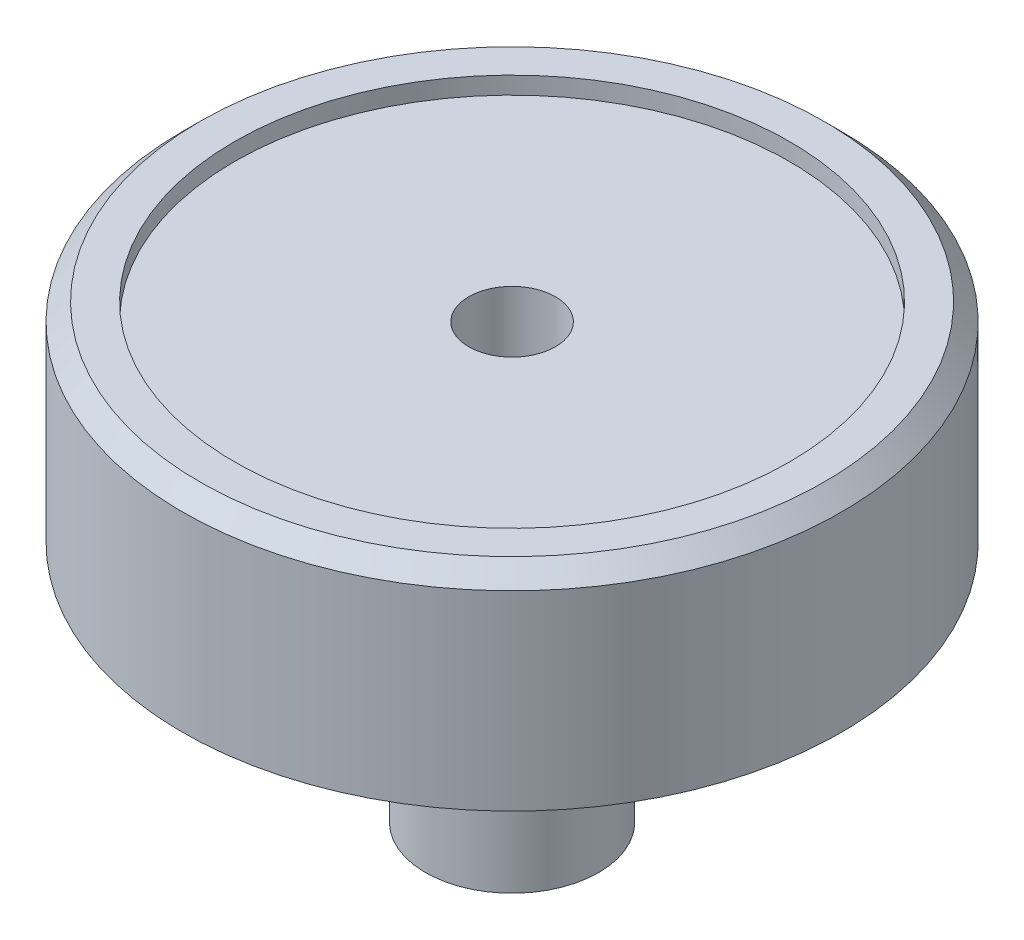
ISO-10303-21;
HEADER;
FILE_DESCRIPTION(('STEP AP214'),'2;1');
FILE_NAME('part.step','',(''),(''),'','','');
FILE_SCHEMA(('AUTOMOTIVE_DESIGN { 1 0 10303 214 1 1 1 1 }'));
ENDSEC;
DATA;
#1=APPLICATION_CONTEXT('core data for automotive mechanical design processes');
#2=APPLICATION_PROTOCOL_DEFINITION('international standard','automotive_design',2000,#1);
#3=PRODUCT_CONTEXT('',#1,'mechanical');
#4=PRODUCT('Part','Part','',(#3));
#5=PRODUCT_RELATED_PRODUCT_CATEGORY('part','',(#4));
#6=PRODUCT_DEFINITION_FORMATION('','',#4);
#7=PRODUCT_DEFINITION_CONTEXT('part definition',#1,'design');
#8=PRODUCT_DEFINITION('design','',#6,#7);
#9=PRODUCT_DEFINITION_SHAPE('','',#8);
#10=(LENGTH_UNIT() NAMED_UNIT(*) SI_UNIT(.MILLI.,.METRE.));
#11=(NAMED_UNIT(*) PLANE_ANGLE_UNIT() SI_UNIT($,.RADIAN.));
#12=(NAMED_UNIT(*) SI_UNIT($,.STERADIAN.) SOLID_ANGLE_UNIT());
#13=UNCERTAINTY_MEASURE_WITH_UNIT(LENGTH_MEASURE(1.E-05),#10,'distance_accuracy_value','');
#14=(GEOMETRIC_REPRESENTATION_CONTEXT(3) GLOBAL_UNCERTAINTY_ASSIGNED_CONTEXT((#13)) GLOBAL_UNIT_ASSIGNED_CONTEXT((#10,
#11,#12)) REPRESENTATION_CONTEXT('',''));
#15=CARTESIAN_POINT('',(0.,0.,0.));
#16=DIRECTION('',(0.,0.,1.));
#17=DIRECTION('',(1.,0.,0.));
#18=AXIS2_PLACEMENT_3D('',#15,#16,#17);
#19=CARTESIAN_POINT('',(-6.,0.,0.));
#20=DIRECTION('',(0.,-1.,0.));
#21=DIRECTION('',(1.,0.,0.));
#22=AXIS2_PLACEMENT_3D('',#19,#20,#21);
#23=PLANE('',#22);
#24=CARTESIAN_POINT('',(0.,0.,0.));
#25=DIRECTION('',(0.,1.,0.));
#26=DIRECTION('',(-1.,0.,0.));
#27=AXIS2_PLACEMENT_3D('',#24,#25,#26);
#28=CIRCLE('',#27,6.00000000000001);
#29=CARTESIAN_POINT('',(-6.,0.,0.));
#30=VERTEX_POINT('',#29);
#31=EDGE_CURVE('E163',#30,#30,#28,.T.);
#32=ORIENTED_EDGE('',*,*,#31,.F.);
#33=EDGE_LOOP('',(#32));
#34=FACE_BOUND('',#33,.T.);
#35=DIRECTION('',(1.,0.,0.));
#36=VECTOR('',#35,1.);
#37=CARTESIAN_POINT('',(-1.175,0.,-3.175));
#38=LINE('',#37,#36);
#39=CARTESIAN_POINT('',(-1.175,0.,-3.175));
#40=VERTEX_POINT('',#39);
#41=CARTESIAN_POINT('',(1.175,0.,-3.175));
#42=VERTEX_POINT('',#41);
#43=EDGE_CURVE('E135',#40,#42,#38,.T.);
#44=ORIENTED_EDGE('',*,*,#43,.F.);
#45=CARTESIAN_POINT('',(-1.175,0.,-1.175));
#46=DIRECTION('',(0.,-1.,0.));
#47=DIRECTION('',(1.,0.,0.));
#48=AXIS2_PLACEMENT_3D('',#45,#46,#47);
#49=CIRCLE('',#48,2.);
#50=CARTESIAN_POINT('',(-3.175,0.,-1.175));
#51=VERTEX_POINT('',#50);
#52=EDGE_CURVE('E132',#51,#40,#49,.T.);
#53=ORIENTED_EDGE('',*,*,#52,.F.);
#54=DIRECTION('',(0.,0.,-1.));
#55=VECTOR('',#54,1.);
#56=CARTESIAN_POINT('',(-3.175,0.,1.175));
#57=LINE('',#56,#55);
#58=CARTESIAN_POINT('',(-3.175,0.,1.175));
#59=VERTEX_POINT('',#58);
#60=EDGE_CURVE('E85',#59,#51,#57,.T.);
#61=ORIENTED_EDGE('',*,*,#60,.F.);
#62=CARTESIAN_POINT('',(-1.175,0.,1.175));
#63=DIRECTION('',(0.,-1.,0.));
#64=DIRECTION('',(1.,0.,0.));
#65=AXIS2_PLACEMENT_3D('',#62,#63,#64);
#66=CIRCLE('',#65,2.);
#67=CARTESIAN_POINT('',(-1.175,0.,3.175));
#68=VERTEX_POINT('',#67);
#69=EDGE_CURVE('E145',#68,#59,#66,.T.);
#70=ORIENTED_EDGE('',*,*,#69,.F.);
#71=DIRECTION('',(-1.,0.,0.));
#72=VECTOR('',#71,1.);
#73=CARTESIAN_POINT('',(-1.175,0.,3.175));
#74=LINE('',#73,#72);
#75=CARTESIAN_POINT('',(1.175,0.,3.175));
#76=VERTEX_POINT('',#75);
#77=EDGE_CURVE('E121',#76,#68,#74,.T.);
#78=ORIENTED_EDGE('',*,*,#77,.F.);
#79=CARTESIAN_POINT('',(1.175,0.,1.175));
#80=DIRECTION('',(0.,-1.,0.));
#81=DIRECTION('',(-1.,0.,0.));
#82=AXIS2_PLACEMENT_3D('',#79,#80,#81);
#83=CIRCLE('',#82,2.);
#84=CARTESIAN_POINT('',(3.175,0.,1.175));
#85=VERTEX_POINT('',#84);
#86=EDGE_CURVE('E142',#85,#76,#83,.T.);
#87=ORIENTED_EDGE('',*,*,#86,.F.);
#88=DIRECTION('',(0.,0.,1.));
#89=VECTOR('',#88,1.);
#90=CARTESIAN_POINT('',(3.175,0.,1.175));
#91=LINE('',#90,#89);
#92=CARTESIAN_POINT('',(3.175,0.,-1.175));
#93=VERTEX_POINT('',#92);
#94=EDGE_CURVE('E140',#93,#85,#91,.T.);
#95=ORIENTED_EDGE('',*,*,#94,.F.);
#96=CARTESIAN_POINT('',(1.175,0.,-1.175));
#97=DIRECTION('',(0.,-1.,0.));
#98=DIRECTION('',(1.,0.,0.));
#99=AXIS2_PLACEMENT_3D('',#96,#97,#98);
#100=CIRCLE('',#99,2.);
#101=EDGE_CURVE('E138',#42,#93,#100,.T.);
#102=ORIENTED_EDGE('',*,*,#101,.F.);
#103=EDGE_LOOP('',(#44,#53,#61,#70,#78,#87,#95,#102));
#104=FACE_BOUND('',#103,.T.);
#105=ADVANCED_FACE('F35',(#34,#104),#23,.T.);
#106=CARTESIAN_POINT('',(0.,4.50000000000001,0.));
#107=DIRECTION('',(0.,1.,0.));
#108=DIRECTION('',(-1.,0.,0.));
#109=AXIS2_PLACEMENT_3D('',#106,#107,#108);
#110=PLANE('',#109);
#111=CARTESIAN_POINT('',(0.,4.50000000000001,0.));
#112=DIRECTION('',(0.,1.,0.));
#113=DIRECTION('',(-1.,0.,0.));
#114=AXIS2_PLACEMENT_3D('',#111,#112,#113);
#115=CIRCLE('',#114,8.);
#116=CARTESIAN_POINT('',(-8.,4.50000000000001,0.));
#117=VERTEX_POINT('',#116);
#118=EDGE_CURVE('E378',#117,#117,#115,.T.);
#119=ORIENTED_EDGE('',*,*,#118,.F.);
#120=EDGE_LOOP('',(#119));
#121=FACE_BOUND('',#120,.T.);
#122=CARTESIAN_POINT('',(0.,4.50000000000001,0.));
#123=DIRECTION('',(0.,1.,0.));
#124=DIRECTION('',(-1.,0.,0.));
#125=AXIS2_PLACEMENT_3D('',#122,#123,#124);
#126=CIRCLE('',#125,9.);
#127=CARTESIAN_POINT('',(-9.,4.5,0.));
#128=VERTEX_POINT('',#127);
#129=EDGE_CURVE('E171',#128,#128,#126,.T.);
#130=ORIENTED_EDGE('',*,*,#129,.T.);
#131=EDGE_LOOP('',(#130));
#132=FACE_BOUND('',#131,.T.);
#133=ADVANCED_FACE('F196',(#121,#132),#110,.T.);
#134=CARTESIAN_POINT('',(0.,4.5,0.));
#135=DIRECTION('',(0.,1.,0.));
#136=DIRECTION('',(-1.,0.,0.));
#137=AXIS2_PLACEMENT_3D('',#134,#135,#136);
#138=CYLINDRICAL_SURFACE('',#137,9.50000000000001);
#139=CARTESIAN_POINT('',(0.,4.,0.));
#140=DIRECTION('',(0.,1.,0.));
#141=DIRECTION('',(-1.,0.,0.));
#142=AXIS2_PLACEMENT_3D('',#139,#140,#141);
#143=CIRCLE('',#142,9.50000000000001);
#144=CARTESIAN_POINT('',(-9.5,3.99999999999999,0.));
#145=VERTEX_POINT('',#144);
#146=EDGE_CURVE('E39',#145,#145,#143,.F.);
#147=ORIENTED_EDGE('',*,*,#146,.T.);
#148=EDGE_LOOP('',(#147));
#149=FACE_BOUND('',#148,.T.);
#150=CARTESIAN_POINT('',(0.,-1.49999999999999,0.));
#151=DIRECTION('',(0.,1.,0.));
#152=DIRECTION('',(-1.,0.,0.));
#153=AXIS2_PLACEMENT_3D('',#150,#151,#152);
#154=CIRCLE('',#153,9.50000000000001);
#155=CARTESIAN_POINT('',(-9.5,-1.5,0.));
#156=VERTEX_POINT('',#155);
#157=EDGE_CURVE('E169',#156,#156,#154,.T.);
#158=ORIENTED_EDGE('',*,*,#157,.T.);
#159=EDGE_LOOP('',(#158));
#160=FACE_BOUND('',#159,.T.);
#161=ADVANCED_FACE('F178',(#149,#160),#138,.T.);
#162=CARTESIAN_POINT('',(-9.5,-1.5,0.));
#163=DIRECTION('',(0.,-1.,0.));
#164=DIRECTION('',(1.,0.,0.));
#165=AXIS2_PLACEMENT_3D('',#162,#163,#164);
#166=PLANE('',#165);
#167=CARTESIAN_POINT('',(0.,-1.49999999999999,0.));
#168=DIRECTION('',(0.,1.,0.));
#169=DIRECTION('',(-1.,0.,0.));
#170=AXIS2_PLACEMENT_3D('',#167,#168,#169);
#171=CIRCLE('',#170,6.00000000000001);
#172=CARTESIAN_POINT('',(-6.,-1.5,0.));
#173=VERTEX_POINT('',#172);
#174=EDGE_CURVE('E166',#173,#173,#171,.T.);
#175=ORIENTED_EDGE('',*,*,#174,.T.);
#176=EDGE_LOOP('',(#175));
#177=FACE_BOUND('',#176,.T.);
#178=ORIENTED_EDGE('',*,*,#157,.F.);
#179=EDGE_LOOP('',(#178));
#180=FACE_BOUND('',#179,.T.);
#181=ADVANCED_FACE('F192',(#177,#180),#166,.T.);
#182=CARTESIAN_POINT('',(0.,4.5,0.));
#183=DIRECTION('',(0.,1.,0.));
#184=DIRECTION('',(-1.,0.,0.));
#185=AXIS2_PLACEMENT_3D('',#182,#183,#184);
#186=CYLINDRICAL_SURFACE('',#185,6.00000000000001);
#187=ORIENTED_EDGE('',*,*,#31,.T.);
#188=EDGE_LOOP('',(#187));
#189=FACE_BOUND('',#188,.T.);
#190=ORIENTED_EDGE('',*,*,#174,.F.);
#191=EDGE_LOOP('',(#190));
#192=FACE_BOUND('',#191,.T.);
#193=ADVANCED_FACE('F184',(#189,#192),#186,.F.);
#194=CARTESIAN_POINT('',(0.,4.50000000000001,0.));
#195=DIRECTION('',(0.,-1.,0.));
#196=DIRECTION('',(1.,0.,0.));
#197=AXIS2_PLACEMENT_3D('',#194,#195,#196);
#198=CONICAL_SURFACE('',#197,9.,0.785398163397447);
#199=ORIENTED_EDGE('',*,*,#146,.F.);
#200=EDGE_LOOP('',(#199));
#201=FACE_BOUND('',#200,.T.);
#202=ORIENTED_EDGE('',*,*,#129,.F.);
#203=EDGE_LOOP('',(#202));
#204=FACE_BOUND('',#203,.T.);
#205=ADVANCED_FACE('F37',(#201,#204),#198,.T.);
#206=CARTESIAN_POINT('',(-1.17499999999999,-5.5,-1.175));
#207=DIRECTION('',(0.,1.,0.));
#208=DIRECTION('',(-1.,0.,0.));
#209=AXIS2_PLACEMENT_3D('',#206,#207,#208);
#210=CYLINDRICAL_SURFACE('',#209,2.);
#211=ORIENTED_EDGE('',*,*,#52,.T.);
#212=DIRECTION('',(0.,1.,0.));
#213=VECTOR('',#212,1.);
#214=CARTESIAN_POINT('',(-1.17499999999999,-5.5,-3.175));
#215=LINE('',#214,#213);
#216=CARTESIAN_POINT('',(-1.17499999999999,-5.5,-3.175));
#217=VERTEX_POINT('',#216);
#218=EDGE_CURVE('E161',#217,#40,#215,.T.);
#219=ORIENTED_EDGE('',*,*,#218,.F.);
#220=CARTESIAN_POINT('',(-1.17499999999999,-5.5,-1.175));
#221=DIRECTION('',(0.,-1.,0.));
#222=DIRECTION('',(1.,0.,0.));
#223=AXIS2_PLACEMENT_3D('',#220,#221,#222);
#224=CIRCLE('',#223,2.);
#225=CARTESIAN_POINT('',(-3.17499999999999,-5.5,-1.175));
#226=VERTEX_POINT('',#225);
#227=EDGE_CURVE('E148',#226,#217,#224,.T.);
#228=ORIENTED_EDGE('',*,*,#227,.F.);
#229=DIRECTION('',(0.,1.,0.));
#230=VECTOR('',#229,1.);
#231=CARTESIAN_POINT('',(-3.17499999999999,-5.5,-1.175));
#232=LINE('',#231,#230);
#233=EDGE_CURVE('E128',#226,#51,#232,.T.);
#234=ORIENTED_EDGE('',*,*,#233,.T.);
#235=EDGE_LOOP('',(#211,#219,#228,#234));
#236=FACE_BOUND('',#235,.T.);
#237=ADVANCED_FACE('F183',(#236),#210,.T.);
#238=CARTESIAN_POINT('',(-1.17499999999999,-5.5,-3.175));
#239=DIRECTION('',(0.,0.,1.));
#240=DIRECTION('',(1.,0.,0.));
#241=AXIS2_PLACEMENT_3D('',#238,#239,#240);
#242=PLANE('',#241);
#243=ORIENTED_EDGE('',*,*,#43,.T.);
#244=DIRECTION('',(0.,1.,0.));
#245=VECTOR('',#244,1.);
#246=CARTESIAN_POINT('',(1.17500000000001,-5.5,-3.175));
#247=LINE('',#246,#245);
#248=CARTESIAN_POINT('',(1.17500000000001,-5.5,-3.175));
#249=VERTEX_POINT('',#248);
#250=EDGE_CURVE('E158',#249,#42,#247,.T.);
#251=ORIENTED_EDGE('',*,*,#250,.F.);
#252=DIRECTION('',(1.,0.,0.));
#253=VECTOR('',#252,1.);
#254=CARTESIAN_POINT('',(-1.17499999999999,-5.5,-3.175));
#255=LINE('',#254,#253);
#256=EDGE_CURVE('E93',#217,#249,#255,.T.);
#257=ORIENTED_EDGE('',*,*,#256,.F.);
#258=ORIENTED_EDGE('',*,*,#218,.T.);
#259=EDGE_LOOP('',(#243,#251,#257,#258));
#260=FACE_BOUND('',#259,.T.);
#261=ADVANCED_FACE('F189',(#260),#242,.F.);
#262=CARTESIAN_POINT('',(1.17500000000001,-5.5,-1.175));
#263=DIRECTION('',(0.,1.,0.));
#264=DIRECTION('',(-1.,0.,0.));
#265=AXIS2_PLACEMENT_3D('',#262,#263,#264);
#266=CYLINDRICAL_SURFACE('',#265,2.);
#267=ORIENTED_EDGE('',*,*,#101,.T.);
#268=DIRECTION('',(0.,1.,0.));
#269=VECTOR('',#268,1.);
#270=CARTESIAN_POINT('',(3.17500000000001,-5.5,-1.175));
#271=LINE('',#270,#269);
#272=CARTESIAN_POINT('',(3.17500000000001,-5.5,-1.175));
#273=VERTEX_POINT('',#272);
#274=EDGE_CURVE('E155',#273,#93,#271,.T.);
#275=ORIENTED_EDGE('',*,*,#274,.F.);
#276=CARTESIAN_POINT('',(1.17500000000001,-5.5,-1.175));
#277=DIRECTION('',(0.,-1.,0.));
#278=DIRECTION('',(1.,0.,0.));
#279=AXIS2_PLACEMENT_3D('',#276,#277,#278);
#280=CIRCLE('',#279,2.);
#281=EDGE_CURVE('E386',#249,#273,#280,.T.);
#282=ORIENTED_EDGE('',*,*,#281,.F.);
#283=ORIENTED_EDGE('',*,*,#250,.T.);
#284=EDGE_LOOP('',(#267,#275,#282,#283));
#285=FACE_BOUND('',#284,.T.);
#286=ADVANCED_FACE('F248',(#285),#266,.T.);
#287=CARTESIAN_POINT('',(3.17500000000001,-5.5,1.175));
#288=DIRECTION('',(-1.,0.,0.));
#289=DIRECTION('',(0.,-1.,0.));
#290=AXIS2_PLACEMENT_3D('',#287,#288,#289);
#291=PLANE('',#290);
#292=ORIENTED_EDGE('',*,*,#94,.T.);
#293=DIRECTION('',(0.,1.,0.));
#294=VECTOR('',#293,1.);
#295=CARTESIAN_POINT('',(3.17500000000001,-5.5,1.175));
#296=LINE('',#295,#294);
#297=CARTESIAN_POINT('',(3.17500000000001,-5.5,1.175));
#298=VERTEX_POINT('',#297);
#299=EDGE_CURVE('E152',#298,#85,#296,.T.);
#300=ORIENTED_EDGE('',*,*,#299,.F.);
#301=DIRECTION('',(0.,0.,1.));
#302=VECTOR('',#301,1.);
#303=CARTESIAN_POINT('',(3.17500000000001,-5.5,1.175));
#304=LINE('',#303,#302);
#305=EDGE_CURVE('E388',#273,#298,#304,.T.);
#306=ORIENTED_EDGE('',*,*,#305,.F.);
#307=ORIENTED_EDGE('',*,*,#274,.T.);
#308=EDGE_LOOP('',(#292,#300,#306,#307));
#309=FACE_BOUND('',#308,.T.);
#310=ADVANCED_FACE('F255',(#309),#291,.F.);
#311=CARTESIAN_POINT('',(1.17500000000001,-5.5,1.175));
#312=DIRECTION('',(0.,1.,0.));
#313=DIRECTION('',(-1.,0.,0.));
#314=AXIS2_PLACEMENT_3D('',#311,#312,#313);
#315=CYLINDRICAL_SURFACE('',#314,2.);
#316=ORIENTED_EDGE('',*,*,#86,.T.);
#317=DIRECTION('',(0.,1.,0.));
#318=VECTOR('',#317,1.);
#319=CARTESIAN_POINT('',(1.17500000000001,-5.5,3.175));
#320=LINE('',#319,#318);
#321=CARTESIAN_POINT('',(1.17500000000001,-5.5,3.175));
#322=VERTEX_POINT('',#321);
#323=EDGE_CURVE('E124',#322,#76,#320,.T.);
#324=ORIENTED_EDGE('',*,*,#323,.F.);
#325=CARTESIAN_POINT('',(1.17500000000001,-5.5,1.175));
#326=DIRECTION('',(0.,-1.,0.));
#327=DIRECTION('',(-1.,0.,0.));
#328=AXIS2_PLACEMENT_3D('',#325,#326,#327);
#329=CIRCLE('',#328,2.);
#330=EDGE_CURVE('E112',#298,#322,#329,.T.);
#331=ORIENTED_EDGE('',*,*,#330,.F.);
#332=ORIENTED_EDGE('',*,*,#299,.T.);
#333=EDGE_LOOP('',(#316,#324,#331,#332));
#334=FACE_BOUND('',#333,.T.);
#335=ADVANCED_FACE('F264',(#334),#315,.T.);
#336=CARTESIAN_POINT('',(-1.17499999999999,-5.5,3.175));
#337=DIRECTION('',(0.,0.,-1.));
#338=DIRECTION('',(-1.,0.,0.));
#339=AXIS2_PLACEMENT_3D('',#336,#337,#338);
#340=PLANE('',#339);
#341=ORIENTED_EDGE('',*,*,#77,.T.);
#342=DIRECTION('',(0.,1.,0.));
#343=VECTOR('',#342,1.);
#344=CARTESIAN_POINT('',(-1.17499999999999,-5.5,3.175));
#345=LINE('',#344,#343);
#346=CARTESIAN_POINT('',(-1.17499999999999,-5.5,3.175));
#347=VERTEX_POINT('',#346);
#348=EDGE_CURVE('E118',#347,#68,#345,.T.);
#349=ORIENTED_EDGE('',*,*,#348,.F.);
#350=DIRECTION('',(-1.,0.,0.));
#351=VECTOR('',#350,1.);
#352=CARTESIAN_POINT('',(-1.17499999999999,-5.5,3.175));
#353=LINE('',#352,#351);
#354=EDGE_CURVE('E106',#322,#347,#353,.T.);
#355=ORIENTED_EDGE('',*,*,#354,.F.);
#356=ORIENTED_EDGE('',*,*,#323,.T.);
#357=EDGE_LOOP('',(#341,#349,#355,#356));
#358=FACE_BOUND('',#357,.T.);
#359=ADVANCED_FACE('F119',(#358),#340,.F.);
#360=CARTESIAN_POINT('',(-1.17499999999999,-5.5,1.175));
#361=DIRECTION('',(0.,1.,0.));
#362=DIRECTION('',(-1.,0.,0.));
#363=AXIS2_PLACEMENT_3D('',#360,#361,#362);
#364=CYLINDRICAL_SURFACE('',#363,2.);
#365=ORIENTED_EDGE('',*,*,#69,.T.);
#366=DIRECTION('',(0.,1.,0.));
#367=VECTOR('',#366,1.);
#368=CARTESIAN_POINT('',(-3.17499999999999,-5.5,1.175));
#369=LINE('',#368,#367);
#370=CARTESIAN_POINT('',(-3.17499999999999,-5.5,1.175));
#371=VERTEX_POINT('',#370);
#372=EDGE_CURVE('E51',#371,#59,#369,.T.);
#373=ORIENTED_EDGE('',*,*,#372,.F.);
#374=CARTESIAN_POINT('',(-1.17499999999999,-5.5,1.175));
#375=DIRECTION('',(0.,-1.,0.));
#376=DIRECTION('',(1.,0.,0.));
#377=AXIS2_PLACEMENT_3D('',#374,#375,#376);
#378=CIRCLE('',#377,2.);
#379=EDGE_CURVE('E110',#347,#371,#378,.T.);
#380=ORIENTED_EDGE('',*,*,#379,.F.);
#381=ORIENTED_EDGE('',*,*,#348,.T.);
#382=EDGE_LOOP('',(#365,#373,#380,#381));
#383=FACE_BOUND('',#382,.T.);
#384=ADVANCED_FACE('F126',(#383),#364,.T.);
#385=CARTESIAN_POINT('',(-3.17499999999999,-5.5,1.175));
#386=DIRECTION('',(1.,0.,0.));
#387=DIRECTION('',(0.,1.,0.));
#388=AXIS2_PLACEMENT_3D('',#385,#386,#387);
#389=PLANE('',#388);
#390=ORIENTED_EDGE('',*,*,#60,.T.);
#391=ORIENTED_EDGE('',*,*,#233,.F.);
#392=DIRECTION('',(0.,0.,-1.));
#393=VECTOR('',#392,1.);
#394=CARTESIAN_POINT('',(-3.17499999999999,-5.5,1.175));
#395=LINE('',#394,#393);
#396=EDGE_CURVE('E59',#371,#226,#395,.T.);
#397=ORIENTED_EDGE('',*,*,#396,.F.);
#398=ORIENTED_EDGE('',*,*,#372,.T.);
#399=EDGE_LOOP('',(#390,#391,#397,#398));
#400=FACE_BOUND('',#399,.T.);
#401=ADVANCED_FACE('F288',(#400),#389,.F.);
#402=CARTESIAN_POINT('',(-1.17499999999999,-5.5,-1.175));
#403=DIRECTION('',(0.,-1.,0.));
#404=DIRECTION('',(1.,0.,0.));
#405=AXIS2_PLACEMENT_3D('',#402,#403,#404);
#406=PLANE('',#405);
#407=CARTESIAN_POINT('',(0.,-5.5,0.));
#408=DIRECTION('',(0.,-1.,0.));
#409=DIRECTION('',(1.,0.,0.));
#410=AXIS2_PLACEMENT_3D('',#407,#408,#409);
#411=CIRCLE('',#410,2.5);
#412=CARTESIAN_POINT('',(2.50000000000001,-5.5,0.));
#413=VERTEX_POINT('',#412);
#414=EDGE_CURVE('E11',#413,#413,#411,.T.);
#415=ORIENTED_EDGE('',*,*,#414,.F.);
#416=EDGE_LOOP('',(#415));
#417=FACE_BOUND('',#416,.T.);
#418=ORIENTED_EDGE('',*,*,#227,.T.);
#419=ORIENTED_EDGE('',*,*,#256,.T.);
#420=ORIENTED_EDGE('',*,*,#281,.T.);
#421=ORIENTED_EDGE('',*,*,#305,.T.);
#422=ORIENTED_EDGE('',*,*,#330,.T.);
#423=ORIENTED_EDGE('',*,*,#354,.T.);
#424=ORIENTED_EDGE('',*,*,#379,.T.);
#425=ORIENTED_EDGE('',*,*,#396,.T.);
#426=EDGE_LOOP('',(#418,#419,#420,#421,#422,#423,#424,#425));
#427=FACE_BOUND('',#426,.T.);
#428=ADVANCED_FACE('F108',(#417,#427),#406,.T.);
#429=CARTESIAN_POINT('',(0.,4.00000000000001,0.));
#430=DIRECTION('',(0.,1.,0.));
#431=DIRECTION('',(-1.,0.,0.));
#432=AXIS2_PLACEMENT_3D('',#429,#430,#431);
#433=CYLINDRICAL_SURFACE('',#432,8.);
#434=CARTESIAN_POINT('',(0.,4.00000000000001,0.));
#435=DIRECTION('',(0.,1.,0.));
#436=DIRECTION('',(-1.,0.,0.));
#437=AXIS2_PLACEMENT_3D('',#434,#435,#436);
#438=CIRCLE('',#437,8.);
#439=CARTESIAN_POINT('',(-8.,4.00000000000001,0.));
#440=VERTEX_POINT('',#439);
#441=EDGE_CURVE('E136',#440,#440,#438,.T.);
#442=ORIENTED_EDGE('',*,*,#441,.F.);
#443=EDGE_LOOP('',(#442));
#444=FACE_BOUND('',#443,.T.);
#445=ORIENTED_EDGE('',*,*,#118,.T.);
#446=EDGE_LOOP('',(#445));
#447=FACE_BOUND('',#446,.T.);
#448=ADVANCED_FACE('F303',(#444,#447),#433,.F.);
#449=CARTESIAN_POINT('',(0.,4.00000000000001,0.));
#450=DIRECTION('',(0.,1.,0.));
#451=DIRECTION('',(-1.,0.,0.));
#452=AXIS2_PLACEMENT_3D('',#449,#450,#451);
#453=PLANE('',#452);
#454=CARTESIAN_POINT('',(0.,4.00000000000001,0.));
#455=DIRECTION('',(0.,1.,0.));
#456=DIRECTION('',(-1.,0.,0.));
#457=AXIS2_PLACEMENT_3D('',#454,#455,#456);
#458=CIRCLE('',#457,1.24999999999999);
#459=CARTESIAN_POINT('',(-1.24999999999998,4.00000000000001,0.));
#460=VERTEX_POINT('',#459);
#461=EDGE_CURVE('E369',#460,#460,#458,.T.);
#462=ORIENTED_EDGE('',*,*,#461,.F.);
#463=EDGE_LOOP('',(#462));
#464=FACE_BOUND('',#463,.T.);
#465=ORIENTED_EDGE('',*,*,#441,.T.);
#466=EDGE_LOOP('',(#465));
#467=FACE_BOUND('',#466,.T.);
#468=ADVANCED_FACE('F313',(#464,#467),#453,.T.);
#469=CARTESIAN_POINT('',(0.,-8.5,0.));
#470=DIRECTION('',(0.,1.,0.));
#471=DIRECTION('',(-1.,0.,0.));
#472=AXIS2_PLACEMENT_3D('',#469,#470,#471);
#473=CYLINDRICAL_SURFACE('',#472,2.5);
#474=CARTESIAN_POINT('',(0.,-8.5,0.));
#475=DIRECTION('',(0.,-1.,0.));
#476=DIRECTION('',(1.,0.,0.));
#477=AXIS2_PLACEMENT_3D('',#474,#475,#476);
#478=CIRCLE('',#477,2.5);
#479=CARTESIAN_POINT('',(2.50000000000001,-8.5,0.));
#480=VERTEX_POINT('',#479);
#481=EDGE_CURVE('E374',#480,#480,#478,.T.);
#482=ORIENTED_EDGE('',*,*,#481,.F.);
#483=EDGE_LOOP('',(#482));
#484=FACE_BOUND('',#483,.T.);
#485=ORIENTED_EDGE('',*,*,#414,.T.);
#486=EDGE_LOOP('',(#485));
#487=FACE_BOUND('',#486,.T.);
#488=ADVANCED_FACE('F322',(#484,#487),#473,.T.);
#489=CARTESIAN_POINT('',(0.,-8.5,0.));
#490=DIRECTION('',(0.,-1.,0.));
#491=DIRECTION('',(1.,0.,0.));
#492=AXIS2_PLACEMENT_3D('',#489,#490,#491);
#493=PLANE('',#492);
#494=CARTESIAN_POINT('',(0.,-8.5,0.));
#495=DIRECTION('',(0.,-1.,0.));
#496=DIRECTION('',(0.,0.,-1.));
#497=AXIS2_PLACEMENT_3D('',#494,#495,#496);
#498=CIRCLE('',#497,1.24999999999999);
#499=CARTESIAN_POINT('',(0.,-8.5,-1.24999999999999));
#500=VERTEX_POINT('',#499);
#501=EDGE_CURVE('E372',#500,#500,#498,.T.);
#502=ORIENTED_EDGE('',*,*,#501,.F.);
#503=EDGE_LOOP('',(#502));
#504=FACE_BOUND('',#503,.T.);
#505=ORIENTED_EDGE('',*,*,#481,.T.);
#506=EDGE_LOOP('',(#505));
#507=FACE_BOUND('',#506,.T.);
#508=ADVANCED_FACE('F331',(#504,#507),#493,.T.);
#509=CARTESIAN_POINT('',(0.,-8.5,0.));
#510=DIRECTION('',(0.,-1.,0.));
#511=DIRECTION('',(0.,0.,-1.));
#512=AXIS2_PLACEMENT_3D('',#509,#510,#511);
#513=CYLINDRICAL_SURFACE('',#512,1.24999999999999);
#514=ORIENTED_EDGE('',*,*,#461,.T.);
#515=EDGE_LOOP('',(#514));
#516=FACE_BOUND('',#515,.T.);
#517=ORIENTED_EDGE('',*,*,#501,.T.);
#518=EDGE_LOOP('',(#517));
#519=FACE_BOUND('',#518,.T.);
#520=ADVANCED_FACE('F339',(#516,#519),#513,.F.);
#521=CLOSED_SHELL('',(#105,#133,#161,#181,#193,#205,#237,#261,#286,#310,#335,#359,#384,#401,
#428,#448,#468,#488,#508,#520));
#522=MANIFOLD_SOLID_BREP('B2',#521);
#523=ADVANCED_BREP_SHAPE_REPRESENTATION('',(#18,#522),#14);
#524=SHAPE_DEFINITION_REPRESENTATION(#9,#523);
ENDSEC;
END-ISO-10303-21;
